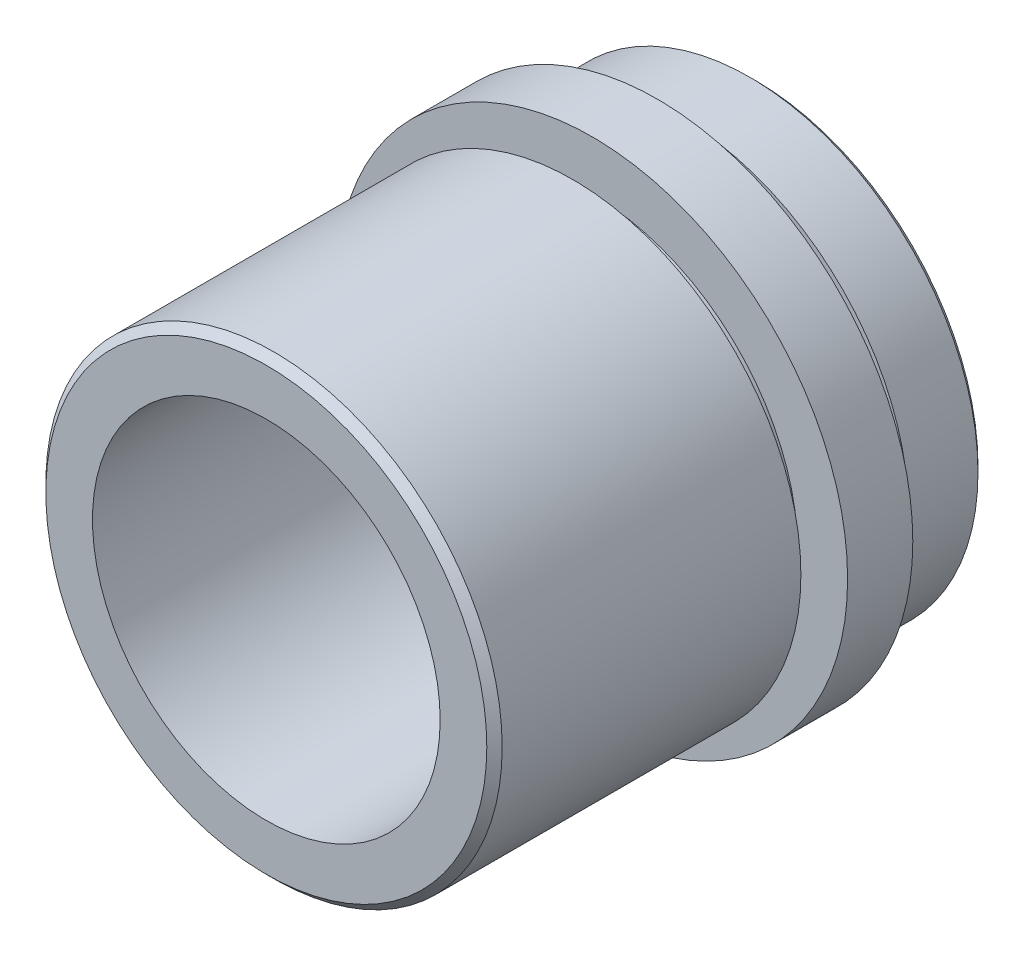
ISO-10303-21;
HEADER;
FILE_DESCRIPTION(('STEP AP214'),'2;1');
FILE_NAME('part.step','',(''),(''),'','','');
FILE_SCHEMA(('AUTOMOTIVE_DESIGN { 1 0 10303 214 1 1 1 1 }'));
ENDSEC;
DATA;
#1=APPLICATION_CONTEXT('core data for automotive mechanical design processes');
#2=APPLICATION_PROTOCOL_DEFINITION('international standard','automotive_design',2000,#1);
#3=PRODUCT_CONTEXT('',#1,'mechanical');
#4=PRODUCT('Part','Part','',(#3));
#5=PRODUCT_RELATED_PRODUCT_CATEGORY('part','',(#4));
#6=PRODUCT_DEFINITION_FORMATION('','',#4);
#7=PRODUCT_DEFINITION_CONTEXT('part definition',#1,'design');
#8=PRODUCT_DEFINITION('design','',#6,#7);
#9=PRODUCT_DEFINITION_SHAPE('','',#8);
#10=(LENGTH_UNIT() NAMED_UNIT(*) SI_UNIT(.MILLI.,.METRE.));
#11=(NAMED_UNIT(*) PLANE_ANGLE_UNIT() SI_UNIT($,.RADIAN.));
#12=(NAMED_UNIT(*) SI_UNIT($,.STERADIAN.) SOLID_ANGLE_UNIT());
#13=UNCERTAINTY_MEASURE_WITH_UNIT(LENGTH_MEASURE(1.E-05),#10,'distance_accuracy_value','');
#14=(GEOMETRIC_REPRESENTATION_CONTEXT(3) GLOBAL_UNCERTAINTY_ASSIGNED_CONTEXT((#13)) GLOBAL_UNIT_ASSIGNED_CONTEXT((#10,
#11,#12)) REPRESENTATION_CONTEXT('',''));
#15=CARTESIAN_POINT('',(0.,0.,0.));
#16=DIRECTION('',(0.,0.,1.));
#17=DIRECTION('',(1.,0.,0.));
#18=AXIS2_PLACEMENT_3D('',#15,#16,#17);
#19=CARTESIAN_POINT('',(0.,0.,0.));
#20=DIRECTION('',(0.,0.,0.999999999999985));
#21=DIRECTION('',(0.999999999999998,0.,0.));
#22=AXIS2_PLACEMENT_3D('',#19,#20,#21);
#23=CYLINDRICAL_SURFACE('',#22,21.);
#24=CARTESIAN_POINT('',(7.21644966006352E-13,0.,0.5));
#25=DIRECTION('',(0.,0.,0.999999999999985));
#26=DIRECTION('',(0.999999999999998,0.,0.));
#27=AXIS2_PLACEMENT_3D('',#24,#25,#26);
#28=CIRCLE('',#27,21.);
#29=CARTESIAN_POINT('',(21.,0.,0.5));
#30=VERTEX_POINT('',#29);
#31=EDGE_CURVE('E73',#30,#30,#28,.T.);
#32=CARTESIAN_POINT('',(0.,0.,6.89999999999999));
#33=DIRECTION('',(0.,0.,0.999999999999985));
#34=DIRECTION('',(0.999999999999998,0.,0.));
#35=AXIS2_PLACEMENT_3D('',#32,#33,#34);
#36=CIRCLE('',#35,21.);
#37=CARTESIAN_POINT('',(21.,0.,6.89999999999999));
#38=VERTEX_POINT('',#37);
#39=EDGE_CURVE('E82',#38,#38,#36,.T.);
#40=CARTESIAN_POINT('',(21.,0.,0.5));
#41=CARTESIAN_POINT('',(21.,0.,0.566666666666667));
#42=CARTESIAN_POINT('',(21.,0.,0.633333333333334));
#43=CARTESIAN_POINT('',(21.,0.,0.766666666666667));
#44=CARTESIAN_POINT('',(21.,0.,0.833333333333333));
#45=CARTESIAN_POINT('',(21.,0.,0.966666666666666));
#46=CARTESIAN_POINT('',(21.,0.,1.03333333333333));
#47=CARTESIAN_POINT('',(21.,0.,1.16666666666667));
#48=CARTESIAN_POINT('',(21.,0.,1.23333333333333));
#49=CARTESIAN_POINT('',(21.,0.,1.36666666666667));
#50=CARTESIAN_POINT('',(21.,0.,1.43333333333333));
#51=CARTESIAN_POINT('',(21.,0.,1.56666666666667));
#52=CARTESIAN_POINT('',(21.,0.,1.63333333333333));
#53=CARTESIAN_POINT('',(21.,0.,1.76666666666666));
#54=CARTESIAN_POINT('',(21.,0.,1.83333333333333));
#55=CARTESIAN_POINT('',(21.,0.,1.96666666666666));
#56=CARTESIAN_POINT('',(21.,0.,2.03333333333333));
#57=CARTESIAN_POINT('',(21.,0.,2.16666666666666));
#58=CARTESIAN_POINT('',(21.,0.,2.23333333333333));
#59=CARTESIAN_POINT('',(21.,0.,2.36666666666666));
#60=CARTESIAN_POINT('',(21.,0.,2.43333333333333));
#61=CARTESIAN_POINT('',(21.,0.,2.56666666666666));
#62=CARTESIAN_POINT('',(21.,0.,2.63333333333333));
#63=CARTESIAN_POINT('',(21.,0.,2.76666666666666));
#64=CARTESIAN_POINT('',(21.,0.,2.83333333333333));
#65=CARTESIAN_POINT('',(21.,0.,2.96666666666666));
#66=CARTESIAN_POINT('',(21.,0.,3.03333333333333));
#67=CARTESIAN_POINT('',(21.,0.,3.16666666666666));
#68=CARTESIAN_POINT('',(21.,0.,3.23333333333333));
#69=CARTESIAN_POINT('',(21.,0.,3.36666666666666));
#70=CARTESIAN_POINT('',(21.,0.,3.43333333333333));
#71=CARTESIAN_POINT('',(21.,0.,3.56666666666666));
#72=CARTESIAN_POINT('',(21.,0.,3.63333333333333));
#73=CARTESIAN_POINT('',(21.,0.,3.76666666666666));
#74=CARTESIAN_POINT('',(21.,0.,3.83333333333333));
#75=CARTESIAN_POINT('',(21.,0.,3.96666666666666));
#76=CARTESIAN_POINT('',(21.,0.,4.03333333333333));
#77=CARTESIAN_POINT('',(21.,0.,4.16666666666666));
#78=CARTESIAN_POINT('',(21.,0.,4.23333333333333));
#79=CARTESIAN_POINT('',(21.,0.,4.36666666666666));
#80=CARTESIAN_POINT('',(21.,0.,4.43333333333333));
#81=CARTESIAN_POINT('',(21.,0.,4.56666666666666));
#82=CARTESIAN_POINT('',(21.,0.,4.63333333333333));
#83=CARTESIAN_POINT('',(21.,0.,4.76666666666666));
#84=CARTESIAN_POINT('',(21.,0.,4.83333333333333));
#85=CARTESIAN_POINT('',(21.,0.,4.96666666666666));
#86=CARTESIAN_POINT('',(21.,0.,5.03333333333333));
#87=CARTESIAN_POINT('',(21.,0.,5.16666666666666));
#88=CARTESIAN_POINT('',(21.,0.,5.23333333333333));
#89=CARTESIAN_POINT('',(21.,0.,5.36666666666666));
#90=CARTESIAN_POINT('',(21.,0.,5.43333333333333));
#91=CARTESIAN_POINT('',(21.,0.,5.56666666666666));
#92=CARTESIAN_POINT('',(21.,0.,5.63333333333332));
#93=CARTESIAN_POINT('',(21.,0.,5.76666666666666));
#94=CARTESIAN_POINT('',(21.,0.,5.83333333333333));
#95=CARTESIAN_POINT('',(21.,0.,5.96666666666666));
#96=CARTESIAN_POINT('',(21.,0.,6.03333333333332));
#97=CARTESIAN_POINT('',(21.,0.,6.16666666666666));
#98=CARTESIAN_POINT('',(21.,0.,6.23333333333332));
#99=CARTESIAN_POINT('',(21.,0.,6.36666666666666));
#100=CARTESIAN_POINT('',(21.,0.,6.43333333333332));
#101=CARTESIAN_POINT('',(21.,0.,6.56666666666666));
#102=CARTESIAN_POINT('',(21.,0.,6.63333333333332));
#103=CARTESIAN_POINT('',(21.,0.,6.76666666666666));
#104=CARTESIAN_POINT('',(21.,0.,6.83333333333332));
#105=CARTESIAN_POINT('',(21.,0.,6.89999999999999));
#106=B_SPLINE_CURVE_WITH_KNOTS('',3,(#40,#41,#42,#43,#44,#45,#46,#47,#48,#49,#50,#51,#52,#53,
#54,#55,#56,#57,#58,#59,#60,#61,#62,#63,#64,#65,#66,#67,#68,#69,#70,#71,#72,#73,#74,#75,#76,#77,
#78,#79,#80,#81,#82,#83,#84,#85,#86,#87,#88,#89,#90,#91,#92,#93,#94,#95,#96,#97,#98,#99,#100,
#101,#102,#103,#104,#105),.UNSPECIFIED.,.F.,.F.,(4,2,2,2,2,2,2,2,2,2,2,2,2,2,2,2,2,2,2,2,2,2,2,
2,2,2,2,2,2,2,2,2,4),(0.,0.2,0.399999999999999,0.599999999999999,0.799999999999998,
0.999999999999998,1.2,1.4,1.6,1.8,2.,2.2,2.4,2.6,2.79999999999999,2.99999999999999,
3.19999999999999,3.39999999999999,3.59999999999999,3.79999999999999,3.99999999999999,
4.19999999999999,4.39999999999999,4.59999999999999,4.79999999999999,4.99999999999999,
5.19999999999999,5.39999999999999,5.59999999999999,5.79999999999999,5.99999999999999,
6.19999999999999,6.39999999999999),.UNSPECIFIED.);
#107=EDGE_CURVE('BSEAM32',#30,#38,#106,.T.);
#108=ORIENTED_EDGE('',*,*,#31,.T.);
#109=ORIENTED_EDGE('',*,*,#39,.F.);
#110=ORIENTED_EDGE('',*,*,#107,.T.);
#111=ORIENTED_EDGE('',*,*,#107,.F.);
#112=EDGE_LOOP('',(#108,#110,#109,#111));
#113=FACE_BOUND('',#112,.T.);
#114=ADVANCED_FACE('F32',(#113),#23,.T.);
#115=CARTESIAN_POINT('',(0.,21.,0.));
#116=DIRECTION('',(0.,0.,0.999999999999985));
#117=DIRECTION('',(0.999999999999998,0.,0.));
#118=AXIS2_PLACEMENT_3D('',#115,#116,#117);
#119=PLANE('',#118);
#120=CARTESIAN_POINT('',(0.,0.,0.));
#121=DIRECTION('',(0.,0.,0.999999999999985));
#122=DIRECTION('',(0.999999999999998,0.,0.));
#123=AXIS2_PLACEMENT_3D('',#120,#121,#122);
#124=CIRCLE('',#123,17.);
#125=CARTESIAN_POINT('',(17.,0.,0.));
#126=VERTEX_POINT('',#125);
#127=EDGE_CURVE('E67',#126,#126,#124,.T.);
#128=ORIENTED_EDGE('',*,*,#127,.T.);
#129=EDGE_LOOP('',(#128));
#130=FACE_BOUND('',#129,.T.);
#131=CARTESIAN_POINT('',(0.,0.,0.));
#132=DIRECTION('',(0.,0.,0.999999999999985));
#133=DIRECTION('',(0.999999999999998,0.,0.));
#134=AXIS2_PLACEMENT_3D('',#131,#132,#133);
#135=CIRCLE('',#134,20.5);
#136=CARTESIAN_POINT('',(20.5000000000007,0.,0.));
#137=VERTEX_POINT('',#136);
#138=EDGE_CURVE('E70',#137,#137,#135,.T.);
#139=ORIENTED_EDGE('',*,*,#138,.F.);
#140=EDGE_LOOP('',(#139));
#141=FACE_BOUND('',#140,.T.);
#142=ADVANCED_FACE('F90',(#130,#141),#119,.F.);
#143=CARTESIAN_POINT('',(4.44089209850063E-13,-1.11022302462516E-13,45.));
#144=DIRECTION('',(0.,0.,-0.999999999999985));
#145=DIRECTION('',(-0.999999999999998,0.,0.));
#146=AXIS2_PLACEMENT_3D('',#143,#144,#145);
#147=PLANE('',#146);
#148=CARTESIAN_POINT('',(4.44089209850063E-13,-1.11022302462516E-13,45.));
#149=DIRECTION('',(0.,0.,0.999999999999985));
#150=DIRECTION('',(0.999999999999998,0.,0.));
#151=AXIS2_PLACEMENT_3D('',#148,#149,#150);
#152=CIRCLE('',#151,20.2928932188134);
#153=CARTESIAN_POINT('',(20.2928932188138,-1.02010447547401E-13,45.));
#154=VERTEX_POINT('',#153);
#155=EDGE_CURVE('E47',#154,#154,#152,.T.);
#156=ORIENTED_EDGE('',*,*,#155,.T.);
#157=EDGE_LOOP('',(#156));
#158=FACE_BOUND('',#157,.T.);
#159=CARTESIAN_POINT('',(4.44089209850063E-13,-1.11022302462516E-13,45.));
#160=DIRECTION('',(0.,0.,0.999999999999985));
#161=DIRECTION('',(0.999999999999998,0.,0.));
#162=AXIS2_PLACEMENT_3D('',#159,#160,#161);
#163=CIRCLE('',#162,16.);
#164=CARTESIAN_POINT('',(16.,0.,45.));
#165=VERTEX_POINT('',#164);
#166=EDGE_CURVE('E61',#165,#165,#163,.T.);
#167=ORIENTED_EDGE('',*,*,#166,.F.);
#168=EDGE_LOOP('',(#167));
#169=FACE_BOUND('',#168,.T.);
#170=ADVANCED_FACE('F96',(#158,#169),#147,.F.);
#171=CARTESIAN_POINT('',(3.88578058618805E-13,23.4999999999989,8.99999999999994));
#172=DIRECTION('',(0.,0.,0.999999999999985));
#173=DIRECTION('',(0.999999999999998,0.,0.));
#174=AXIS2_PLACEMENT_3D('',#171,#172,#173);
#175=PLANE('',#174);
#176=CARTESIAN_POINT('',(7.49400541621981E-13,-1.11022302462516E-13,8.99999999999998));
#177=DIRECTION('',(0.,0.,0.999999999999985));
#178=DIRECTION('',(0.999999999999998,0.,0.));
#179=AXIS2_PLACEMENT_3D('',#176,#177,#178);
#180=CIRCLE('',#179,23.5);
#181=CARTESIAN_POINT('',(23.5000000000007,-1.00586206031039E-13,8.99999999999998));
#182=VERTEX_POINT('',#181);
#183=EDGE_CURVE('E39',#182,#182,#180,.T.);
#184=ORIENTED_EDGE('',*,*,#183,.F.);
#185=EDGE_LOOP('',(#184));
#186=FACE_BOUND('',#185,.T.);
#187=CARTESIAN_POINT('',(7.49400541621981E-13,-1.11022302462516E-13,8.99999999999998));
#188=DIRECTION('',(0.,0.,0.999999999999985));
#189=DIRECTION('',(0.999999999999998,0.,0.));
#190=AXIS2_PLACEMENT_3D('',#187,#188,#189);
#191=CIRCLE('',#190,18.9);
#192=CARTESIAN_POINT('',(18.9,0.,8.99999999999998));
#193=VERTEX_POINT('',#192);
#194=EDGE_CURVE('E76',#193,#193,#191,.T.);
#195=ORIENTED_EDGE('',*,*,#194,.T.);
#196=EDGE_LOOP('',(#195));
#197=FACE_BOUND('',#196,.T.);
#198=ADVANCED_FACE('F117',(#186,#197),#175,.F.);
#199=CARTESIAN_POINT('',(0.,0.,15.));
#200=DIRECTION('',(0.,0.,0.999999999999985));
#201=DIRECTION('',(0.999999999999998,0.,0.));
#202=AXIS2_PLACEMENT_3D('',#199,#200,#201);
#203=CYLINDRICAL_SURFACE('',#202,21.);
#204=CARTESIAN_POINT('',(4.44089209850063E-13,-1.11022302462516E-13,44.2928932188134));
#205=DIRECTION('',(0.,0.,0.999999999999985));
#206=DIRECTION('',(0.999999999999998,0.,0.));
#207=AXIS2_PLACEMENT_3D('',#204,#205,#206);
#208=CIRCLE('',#207,21.);
#209=CARTESIAN_POINT('',(21.,0.,44.2928932188134));
#210=VERTEX_POINT('',#209);
#211=EDGE_CURVE('E43',#210,#210,#208,.T.);
#212=CARTESIAN_POINT('',(7.7715611723761E-13,0.,16.8));
#213=DIRECTION('',(0.,0.,0.999999999999985));
#214=DIRECTION('',(0.999999999999998,0.,0.));
#215=AXIS2_PLACEMENT_3D('',#212,#213,#214);
#216=CIRCLE('',#215,21.);
#217=CARTESIAN_POINT('',(21.,0.,16.8));
#218=VERTEX_POINT('',#217);
#219=EDGE_CURVE('E52',#218,#218,#216,.T.);
#220=CARTESIAN_POINT('',(21.,0.,44.2928932188134));
#221=CARTESIAN_POINT('',(21.,0.,44.0065089144508));
#222=CARTESIAN_POINT('',(21.,0.,43.7201246100882));
#223=CARTESIAN_POINT('',(21.,0.,43.1473560013629));
#224=CARTESIAN_POINT('',(21.,0.,42.8609716970002));
#225=CARTESIAN_POINT('',(21.,0.,42.288203088275));
#226=CARTESIAN_POINT('',(21.,0.,42.0018187839123));
#227=CARTESIAN_POINT('',(21.,0.,41.429050175187));
#228=CARTESIAN_POINT('',(21.,0.,41.1426658708244));
#229=CARTESIAN_POINT('',(21.,0.,40.5698972620991));
#230=CARTESIAN_POINT('',(21.,0.,40.2835129577365));
#231=CARTESIAN_POINT('',(21.,0.,39.7107443490112));
#232=CARTESIAN_POINT('',(21.,0.,39.4243600446486));
#233=CARTESIAN_POINT('',(21.,0.,38.8515914359233));
#234=CARTESIAN_POINT('',(21.,0.,38.5652071315606));
#235=CARTESIAN_POINT('',(21.,0.,37.9924385228354));
#236=CARTESIAN_POINT('',(21.,0.,37.7060542184727));
#237=CARTESIAN_POINT('',(21.,0.,37.1332856097474));
#238=CARTESIAN_POINT('',(21.,0.,36.8469013053848));
#239=CARTESIAN_POINT('',(21.,0.,36.2741326966595));
#240=CARTESIAN_POINT('',(21.,0.,35.9877483922969));
#241=CARTESIAN_POINT('',(21.,0.,35.4149797835716));
#242=CARTESIAN_POINT('',(21.,0.,35.128595479209));
#243=CARTESIAN_POINT('',(21.,0.,34.5558268704837));
#244=CARTESIAN_POINT('',(21.,0.,34.269442566121));
#245=CARTESIAN_POINT('',(21.,0.,33.6966739573958));
#246=CARTESIAN_POINT('',(21.,0.,33.4102896530331));
#247=CARTESIAN_POINT('',(21.,0.,32.8375210443078));
#248=CARTESIAN_POINT('',(21.,0.,32.5511367399452));
#249=CARTESIAN_POINT('',(21.,0.,31.9783681312199));
#250=CARTESIAN_POINT('',(21.,0.,31.6919838268573));
#251=CARTESIAN_POINT('',(21.,0.,31.119215218132));
#252=CARTESIAN_POINT('',(21.,0.,30.8328309137694));
#253=CARTESIAN_POINT('',(21.,0.,30.2600623050441));
#254=CARTESIAN_POINT('',(21.,0.,29.9736780006814));
#255=CARTESIAN_POINT('',(21.,0.,29.4009093919562));
#256=CARTESIAN_POINT('',(21.,0.,29.1145250875935));
#257=CARTESIAN_POINT('',(21.,0.,28.5417564788682));
#258=CARTESIAN_POINT('',(21.,0.,28.2553721745056));
#259=CARTESIAN_POINT('',(21.,0.,27.6826035657803));
#260=CARTESIAN_POINT('',(21.,0.,27.3962192614177));
#261=CARTESIAN_POINT('',(21.,0.,26.8234506526924));
#262=CARTESIAN_POINT('',(21.,0.,26.5370663483298));
#263=CARTESIAN_POINT('',(21.,0.,25.9642977396045));
#264=CARTESIAN_POINT('',(21.,0.,25.6779134352418));
#265=CARTESIAN_POINT('',(21.,0.,25.1051448265166));
#266=CARTESIAN_POINT('',(21.,0.,24.8187605221539));
#267=CARTESIAN_POINT('',(21.,0.,24.2459919134286));
#268=CARTESIAN_POINT('',(21.,0.,23.959607609066));
#269=CARTESIAN_POINT('',(21.,0.,23.3868390003407));
#270=CARTESIAN_POINT('',(21.,0.,23.1004546959781));
#271=CARTESIAN_POINT('',(21.,0.,22.5276860872528));
#272=CARTESIAN_POINT('',(21.,0.,22.2413017828902));
#273=CARTESIAN_POINT('',(21.,0.,21.6685331741649));
#274=CARTESIAN_POINT('',(21.,0.,21.3821488698022));
#275=CARTESIAN_POINT('',(21.,0.,20.809380261077));
#276=CARTESIAN_POINT('',(21.,0.,20.5229959567143));
#277=CARTESIAN_POINT('',(21.,0.,19.950227347989));
#278=CARTESIAN_POINT('',(21.,0.,19.6638430436264));
#279=CARTESIAN_POINT('',(21.,0.,19.0910744349011));
#280=CARTESIAN_POINT('',(21.,0.,18.8046901305385));
#281=CARTESIAN_POINT('',(21.,0.,18.2319215218132));
#282=CARTESIAN_POINT('',(21.,0.,17.9455372174506));
#283=CARTESIAN_POINT('',(21.,0.,17.3727686087253));
#284=CARTESIAN_POINT('',(21.,0.,17.0863843043626));
#285=CARTESIAN_POINT('',(21.,0.,16.8));
#286=B_SPLINE_CURVE_WITH_KNOTS('',3,(#220,#221,#222,#223,#224,#225,#226,#227,#228,#229,#230,
#231,#232,#233,#234,#235,#236,#237,#238,#239,#240,#241,#242,#243,#244,#245,#246,#247,#248,#249,
#250,#251,#252,#253,#254,#255,#256,#257,#258,#259,#260,#261,#262,#263,#264,#265,#266,#267,#268,
#269,#270,#271,#272,#273,#274,#275,#276,#277,#278,#279,#280,#281,#282,#283,#284,#285),
.UNSPECIFIED.,.F.,.F.,(4,2,2,2,2,2,2,2,2,2,2,2,2,2,2,2,2,2,2,2,2,2,2,2,2,2,2,2,2,2,2,2,4),(0.,
0.85915291308792,1.71830582617584,2.57745873926376,3.43661165235168,4.29576456543961,
5.15491747852752,6.01407039161544,6.87322330470336,7.73237621779128,8.5915291308792,
9.45068204396712,10.309834957055,11.168987870143,12.0281407832309,12.8872936963188,
13.7464466094067,14.6055995224946,15.4647524355826,16.3239053486705,17.1830582617584,
18.0422111748463,18.9013640879342,19.7605170010222,20.6196699141101,21.478822827198,
22.3379757402859,23.1971286533738,24.0562815664618,24.9154344795497,25.7745873926376,
26.6337403057255,27.4928932188134),.UNSPECIFIED.);
#287=EDGE_CURVE('BSEAM113',#210,#218,#286,.T.);
#288=ORIENTED_EDGE('',*,*,#211,.F.);
#289=ORIENTED_EDGE('',*,*,#219,.T.);
#290=ORIENTED_EDGE('',*,*,#287,.T.);
#291=ORIENTED_EDGE('',*,*,#287,.F.);
#292=EDGE_LOOP('',(#288,#290,#289,#291));
#293=FACE_BOUND('',#292,.T.);
#294=ADVANCED_FACE('F113',(#293),#203,.T.);
#295=CARTESIAN_POINT('',(4.44089209850063E-13,-1.11022302462516E-13,45.));
#296=DIRECTION('',(0.,0.,-0.999999999999985));
#297=DIRECTION('',(-0.999999999999998,0.,0.));
#298=AXIS2_PLACEMENT_3D('',#295,#296,#297);
#299=CONICAL_SURFACE('',#298,20.2928932188134,0.785398163397461);
#300=ORIENTED_EDGE('',*,*,#211,.T.);
#301=EDGE_LOOP('',(#300));
#302=FACE_BOUND('',#301,.T.);
#303=ORIENTED_EDGE('',*,*,#155,.F.);
#304=EDGE_LOOP('',(#303));
#305=FACE_BOUND('',#304,.T.);
#306=ADVANCED_FACE('F109',(#302,#305),#299,.T.);
#307=CARTESIAN_POINT('',(4.44089209850063E-13,20.9999999999999,16.8));
#308=DIRECTION('',(0.,0.,-0.999999999999985));
#309=DIRECTION('',(-0.999999999999998,0.,0.));
#310=AXIS2_PLACEMENT_3D('',#307,#308,#309);
#311=PLANE('',#310);
#312=CARTESIAN_POINT('',(7.7715611723761E-13,0.,16.8));
#313=DIRECTION('',(0.,0.,0.999999999999985));
#314=DIRECTION('',(0.999999999999998,0.,0.));
#315=AXIS2_PLACEMENT_3D('',#312,#313,#314);
#316=CIRCLE('',#315,18.9);
#317=CARTESIAN_POINT('',(18.9,0.,16.8));
#318=VERTEX_POINT('',#317);
#319=EDGE_CURVE('E55',#318,#318,#316,.T.);
#320=ORIENTED_EDGE('',*,*,#319,.T.);
#321=EDGE_LOOP('',(#320));
#322=FACE_BOUND('',#321,.T.);
#323=ORIENTED_EDGE('',*,*,#219,.F.);
#324=EDGE_LOOP('',(#323));
#325=FACE_BOUND('',#324,.T.);
#326=ADVANCED_FACE('F105',(#322,#325),#311,.T.);
#327=CARTESIAN_POINT('',(0.,0.,15.));
#328=DIRECTION('',(0.,0.,0.999999999999985));
#329=DIRECTION('',(0.999999999999998,0.,0.));
#330=AXIS2_PLACEMENT_3D('',#327,#328,#329);
#331=CYLINDRICAL_SURFACE('',#330,18.9);
#332=CARTESIAN_POINT('',(0.,0.,15.));
#333=DIRECTION('',(0.,0.,0.999999999999985));
#334=DIRECTION('',(0.999999999999998,0.,0.));
#335=AXIS2_PLACEMENT_3D('',#332,#333,#334);
#336=CIRCLE('',#335,18.9);
#337=CARTESIAN_POINT('',(18.9,0.,15.));
#338=VERTEX_POINT('',#337);
#339=EDGE_CURVE('E58',#338,#338,#336,.T.);
#340=CARTESIAN_POINT('',(18.9,0.,15.));
#341=CARTESIAN_POINT('',(18.9,0.,15.01875));
#342=CARTESIAN_POINT('',(18.9,0.,15.0375));
#343=CARTESIAN_POINT('',(18.9,0.,15.075));
#344=CARTESIAN_POINT('',(18.9,0.,15.09375));
#345=CARTESIAN_POINT('',(18.9,0.,15.13125));
#346=CARTESIAN_POINT('',(18.9,0.,15.15));
#347=CARTESIAN_POINT('',(18.9,0.,15.1875));
#348=CARTESIAN_POINT('',(18.9,0.,15.20625));
#349=CARTESIAN_POINT('',(18.9,0.,15.24375));
#350=CARTESIAN_POINT('',(18.9,0.,15.2625));
#351=CARTESIAN_POINT('',(18.9,0.,15.3));
#352=CARTESIAN_POINT('',(18.9,0.,15.31875));
#353=CARTESIAN_POINT('',(18.9,0.,15.35625));
#354=CARTESIAN_POINT('',(18.9,0.,15.375));
#355=CARTESIAN_POINT('',(18.9,0.,15.4125));
#356=CARTESIAN_POINT('',(18.9,0.,15.43125));
#357=CARTESIAN_POINT('',(18.9,0.,15.46875));
#358=CARTESIAN_POINT('',(18.9,0.,15.4875));
#359=CARTESIAN_POINT('',(18.9,0.,15.525));
#360=CARTESIAN_POINT('',(18.9,0.,15.54375));
#361=CARTESIAN_POINT('',(18.9,0.,15.58125));
#362=CARTESIAN_POINT('',(18.9,0.,15.6));
#363=CARTESIAN_POINT('',(18.9,0.,15.6375));
#364=CARTESIAN_POINT('',(18.9,0.,15.65625));
#365=CARTESIAN_POINT('',(18.9,0.,15.69375));
#366=CARTESIAN_POINT('',(18.9,0.,15.7125));
#367=CARTESIAN_POINT('',(18.9,0.,15.75));
#368=CARTESIAN_POINT('',(18.9,0.,15.76875));
#369=CARTESIAN_POINT('',(18.9,0.,15.80625));
#370=CARTESIAN_POINT('',(18.9,0.,15.825));
#371=CARTESIAN_POINT('',(18.9,0.,15.8625));
#372=CARTESIAN_POINT('',(18.9,0.,15.88125));
#373=CARTESIAN_POINT('',(18.9,0.,15.91875));
#374=CARTESIAN_POINT('',(18.9,0.,15.9375));
#375=CARTESIAN_POINT('',(18.9,0.,15.975));
#376=CARTESIAN_POINT('',(18.9,0.,15.99375));
#377=CARTESIAN_POINT('',(18.9,0.,16.03125));
#378=CARTESIAN_POINT('',(18.9,0.,16.05));
#379=CARTESIAN_POINT('',(18.9,0.,16.0875));
#380=CARTESIAN_POINT('',(18.9,0.,16.10625));
#381=CARTESIAN_POINT('',(18.9,0.,16.14375));
#382=CARTESIAN_POINT('',(18.9,0.,16.1625));
#383=CARTESIAN_POINT('',(18.9,0.,16.2));
#384=CARTESIAN_POINT('',(18.9,0.,16.21875));
#385=CARTESIAN_POINT('',(18.9,0.,16.25625));
#386=CARTESIAN_POINT('',(18.9,0.,16.275));
#387=CARTESIAN_POINT('',(18.9,0.,16.3125));
#388=CARTESIAN_POINT('',(18.9,0.,16.33125));
#389=CARTESIAN_POINT('',(18.9,0.,16.36875));
#390=CARTESIAN_POINT('',(18.9,0.,16.3875));
#391=CARTESIAN_POINT('',(18.9,0.,16.425));
#392=CARTESIAN_POINT('',(18.9,0.,16.44375));
#393=CARTESIAN_POINT('',(18.9,0.,16.48125));
#394=CARTESIAN_POINT('',(18.9,0.,16.5));
#395=CARTESIAN_POINT('',(18.9,0.,16.5375));
#396=CARTESIAN_POINT('',(18.9,0.,16.55625));
#397=CARTESIAN_POINT('',(18.9,0.,16.59375));
#398=CARTESIAN_POINT('',(18.9,0.,16.6125));
#399=CARTESIAN_POINT('',(18.9,0.,16.65));
#400=CARTESIAN_POINT('',(18.9,0.,16.66875));
#401=CARTESIAN_POINT('',(18.9,0.,16.70625));
#402=CARTESIAN_POINT('',(18.9,0.,16.725));
#403=CARTESIAN_POINT('',(18.9,0.,16.7625));
#404=CARTESIAN_POINT('',(18.9,0.,16.78125));
#405=CARTESIAN_POINT('',(18.9,0.,16.8));
#406=B_SPLINE_CURVE_WITH_KNOTS('',3,(#340,#341,#342,#343,#344,#345,#346,#347,#348,#349,#350,
#351,#352,#353,#354,#355,#356,#357,#358,#359,#360,#361,#362,#363,#364,#365,#366,#367,#368,#369,
#370,#371,#372,#373,#374,#375,#376,#377,#378,#379,#380,#381,#382,#383,#384,#385,#386,#387,#388,
#389,#390,#391,#392,#393,#394,#395,#396,#397,#398,#399,#400,#401,#402,#403,#404,#405),
.UNSPECIFIED.,.F.,.F.,(4,2,2,2,2,2,2,2,2,2,2,2,2,2,2,2,2,2,2,2,2,2,2,2,2,2,2,2,2,2,2,2,4),(0.,
0.0562500000000007,0.112500000000001,0.168750000000001,0.225000000000001,0.28125,
0.337500000000001,0.39375,0.450000000000001,0.50625,0.5625,0.618749999999999,0.674999999999998,
0.731249999999999,0.7875,0.843750000000001,0.899999999999998,0.956249999999999,1.0125,1.06875,
1.125,1.18125,1.2375,1.29375,1.35,1.40625,1.4625,1.51875,1.575,1.63125,1.6875,1.74375,1.8),.UNSPECIFIED.);
#407=EDGE_CURVE('BSEAM101',#338,#318,#406,.T.);
#408=ORIENTED_EDGE('',*,*,#339,.T.);
#409=ORIENTED_EDGE('',*,*,#319,.F.);
#410=ORIENTED_EDGE('',*,*,#407,.T.);
#411=ORIENTED_EDGE('',*,*,#407,.F.);
#412=EDGE_LOOP('',(#408,#410,#409,#411));
#413=FACE_BOUND('',#412,.T.);
#414=ADVANCED_FACE('F101',(#413),#331,.T.);
#415=CARTESIAN_POINT('',(7.49400541621981E-13,-1.11022302462516E-13,8.99999999999998));
#416=DIRECTION('',(0.,0.,0.999999999999985));
#417=DIRECTION('',(0.999999999999998,0.,0.));
#418=AXIS2_PLACEMENT_3D('',#415,#416,#417);
#419=CYLINDRICAL_SURFACE('',#418,23.5);
#420=CARTESIAN_POINT('',(0.,0.,15.));
#421=DIRECTION('',(0.,0.,0.999999999999985));
#422=DIRECTION('',(0.999999999999998,0.,0.));
#423=AXIS2_PLACEMENT_3D('',#420,#421,#422);
#424=CIRCLE('',#423,23.5);
#425=CARTESIAN_POINT('',(23.5000000000007,-1.00586206031039E-13,15.));
#426=VERTEX_POINT('',#425);
#427=EDGE_CURVE('E10',#426,#426,#424,.T.);
#428=CARTESIAN_POINT('',(23.5000000000007,-1.00586206031039E-13,15.));
#429=CARTESIAN_POINT('',(23.5000000000007,-1.00586206031039E-13,14.9375));
#430=CARTESIAN_POINT('',(23.5000000000007,-1.00586206031039E-13,14.875));
#431=CARTESIAN_POINT('',(23.5000000000007,-1.00586206031039E-13,14.75));
#432=CARTESIAN_POINT('',(23.5000000000007,-1.00586206031039E-13,14.6875));
#433=CARTESIAN_POINT('',(23.5000000000007,-1.00586206031039E-13,14.5625));
#434=CARTESIAN_POINT('',(23.5000000000007,-1.00586206031039E-13,14.5));
#435=CARTESIAN_POINT('',(23.5000000000007,-1.00586206031039E-13,14.375));
#436=CARTESIAN_POINT('',(23.5000000000007,-1.00586206031039E-13,14.3125));
#437=CARTESIAN_POINT('',(23.5000000000007,-1.00586206031039E-13,14.1875));
#438=CARTESIAN_POINT('',(23.5000000000007,-1.00586206031039E-13,14.125));
#439=CARTESIAN_POINT('',(23.5000000000007,-1.00586206031039E-13,14.));
#440=CARTESIAN_POINT('',(23.5000000000007,-1.00586206031039E-13,13.9375));
#441=CARTESIAN_POINT('',(23.5000000000007,-1.00586206031039E-13,13.8125));
#442=CARTESIAN_POINT('',(23.5000000000007,-1.00586206031039E-13,13.75));
#443=CARTESIAN_POINT('',(23.5000000000007,-1.00586206031039E-13,13.625));
#444=CARTESIAN_POINT('',(23.5000000000007,-1.00586206031039E-13,13.5625));
#445=CARTESIAN_POINT('',(23.5000000000007,-1.00586206031039E-13,13.4375));
#446=CARTESIAN_POINT('',(23.5000000000007,-1.00586206031039E-13,13.375));
#447=CARTESIAN_POINT('',(23.5000000000007,-1.00586206031039E-13,13.25));
#448=CARTESIAN_POINT('',(23.5000000000007,-1.00586206031039E-13,13.1875));
#449=CARTESIAN_POINT('',(23.5000000000007,-1.00586206031039E-13,13.0625));
#450=CARTESIAN_POINT('',(23.5000000000007,-1.00586206031039E-13,13.));
#451=CARTESIAN_POINT('',(23.5000000000007,-1.00586206031039E-13,12.875));
#452=CARTESIAN_POINT('',(23.5000000000007,-1.00586206031039E-13,12.8125));
#453=CARTESIAN_POINT('',(23.5000000000007,-1.00586206031039E-13,12.6875));
#454=CARTESIAN_POINT('',(23.5000000000007,-1.00586206031039E-13,12.625));
#455=CARTESIAN_POINT('',(23.5000000000007,-1.00586206031039E-13,12.5));
#456=CARTESIAN_POINT('',(23.5000000000007,-1.00586206031039E-13,12.4375));
#457=CARTESIAN_POINT('',(23.5000000000007,-1.00586206031039E-13,12.3125));
#458=CARTESIAN_POINT('',(23.5000000000007,-1.00586206031039E-13,12.25));
#459=CARTESIAN_POINT('',(23.5000000000007,-1.00586206031039E-13,12.125));
#460=CARTESIAN_POINT('',(23.5000000000007,-1.00586206031039E-13,12.0625));
#461=CARTESIAN_POINT('',(23.5000000000007,-1.00586206031039E-13,11.9375));
#462=CARTESIAN_POINT('',(23.5000000000007,-1.00586206031039E-13,11.875));
#463=CARTESIAN_POINT('',(23.5000000000007,-1.00586206031039E-13,11.75));
#464=CARTESIAN_POINT('',(23.5000000000007,-1.00586206031039E-13,11.6875));
#465=CARTESIAN_POINT('',(23.5000000000007,-1.00586206031039E-13,11.5625));
#466=CARTESIAN_POINT('',(23.5000000000007,-1.00586206031039E-13,11.5));
#467=CARTESIAN_POINT('',(23.5000000000007,-1.00586206031039E-13,11.375));
#468=CARTESIAN_POINT('',(23.5000000000007,-1.00586206031039E-13,11.3125));
#469=CARTESIAN_POINT('',(23.5000000000007,-1.00586206031039E-13,11.1875));
#470=CARTESIAN_POINT('',(23.5000000000007,-1.00586206031039E-13,11.125));
#471=CARTESIAN_POINT('',(23.5000000000007,-1.00586206031039E-13,11.));
#472=CARTESIAN_POINT('',(23.5000000000007,-1.00586206031039E-13,10.9375));
#473=CARTESIAN_POINT('',(23.5000000000007,-1.00586206031039E-13,10.8125));
#474=CARTESIAN_POINT('',(23.5000000000007,-1.00586206031039E-13,10.75));
#475=CARTESIAN_POINT('',(23.5000000000007,-1.00586206031039E-13,10.625));
#476=CARTESIAN_POINT('',(23.5000000000007,-1.00586206031039E-13,10.5625));
#477=CARTESIAN_POINT('',(23.5000000000007,-1.00586206031039E-13,10.4375));
#478=CARTESIAN_POINT('',(23.5000000000007,-1.00586206031039E-13,10.375));
#479=CARTESIAN_POINT('',(23.5000000000007,-1.00586206031039E-13,10.25));
#480=CARTESIAN_POINT('',(23.5000000000007,-1.00586206031039E-13,10.1875));
#481=CARTESIAN_POINT('',(23.5000000000007,-1.00586206031039E-13,10.0625));
#482=CARTESIAN_POINT('',(23.5000000000007,-1.00586206031039E-13,9.99999999999998));
#483=CARTESIAN_POINT('',(23.5000000000007,-1.00586206031039E-13,9.87499999999998));
#484=CARTESIAN_POINT('',(23.5000000000007,-1.00586206031039E-13,9.81249999999998));
#485=CARTESIAN_POINT('',(23.5000000000007,-1.00586206031039E-13,9.68749999999998));
#486=CARTESIAN_POINT('',(23.5000000000007,-1.00586206031039E-13,9.62499999999998));
#487=CARTESIAN_POINT('',(23.5000000000007,-1.00586206031039E-13,9.49999999999998));
#488=CARTESIAN_POINT('',(23.5000000000007,-1.00586206031039E-13,9.43749999999998));
#489=CARTESIAN_POINT('',(23.5000000000007,-1.00586206031039E-13,9.31249999999998));
#490=CARTESIAN_POINT('',(23.5000000000007,-1.00586206031039E-13,9.24999999999998));
#491=CARTESIAN_POINT('',(23.5000000000007,-1.00586206031039E-13,9.12499999999998));
#492=CARTESIAN_POINT('',(23.5000000000007,-1.00586206031039E-13,9.06249999999998));
#493=CARTESIAN_POINT('',(23.5000000000007,-1.00586206031039E-13,8.99999999999998));
#494=B_SPLINE_CURVE_WITH_KNOTS('',3,(#428,#429,#430,#431,#432,#433,#434,#435,#436,#437,#438,
#439,#440,#441,#442,#443,#444,#445,#446,#447,#448,#449,#450,#451,#452,#453,#454,#455,#456,#457,
#458,#459,#460,#461,#462,#463,#464,#465,#466,#467,#468,#469,#470,#471,#472,#473,#474,#475,#476,
#477,#478,#479,#480,#481,#482,#483,#484,#485,#486,#487,#488,#489,#490,#491,#492,#493),
.UNSPECIFIED.,.F.,.F.,(4,2,2,2,2,2,2,2,2,2,2,2,2,2,2,2,2,2,2,2,2,2,2,2,2,2,2,2,2,2,2,2,4),(0.,
0.187500000000002,0.375000000000002,0.562500000000002,0.750000000000002,0.937500000000003,1.125,
1.3125,1.5,1.68750000000001,1.87500000000001,2.06250000000001,2.25000000000001,2.43750000000001,
2.62500000000001,2.81250000000001,3.00000000000001,3.18750000000001,3.37500000000001,
3.56250000000001,3.75000000000001,3.93750000000001,4.12500000000001,4.31250000000001,
4.50000000000002,4.68750000000002,4.87500000000002,5.06250000000002,5.25000000000002,
5.43750000000002,5.62500000000002,5.81250000000002,6.00000000000002),.UNSPECIFIED.);
#495=EDGE_CURVE('BSEAM104',#426,#182,#494,.T.);
#496=ORIENTED_EDGE('',*,*,#427,.F.);
#497=ORIENTED_EDGE('',*,*,#183,.T.);
#498=ORIENTED_EDGE('',*,*,#495,.T.);
#499=ORIENTED_EDGE('',*,*,#495,.F.);
#500=EDGE_LOOP('',(#496,#498,#497,#499));
#501=FACE_BOUND('',#500,.T.);
#502=ADVANCED_FACE('F104',(#501),#419,.T.);
#503=CARTESIAN_POINT('',(0.,0.,15.));
#504=DIRECTION('',(0.,0.,-0.999999999999985));
#505=DIRECTION('',(-0.999999999999998,0.,0.));
#506=AXIS2_PLACEMENT_3D('',#503,#504,#505);
#507=PLANE('',#506);
#508=ORIENTED_EDGE('',*,*,#427,.T.);
#509=EDGE_LOOP('',(#508));
#510=FACE_BOUND('',#509,.T.);
#511=ORIENTED_EDGE('',*,*,#339,.F.);
#512=EDGE_LOOP('',(#511));
#513=FACE_BOUND('',#512,.T.);
#514=ADVANCED_FACE('F34',(#510,#513),#507,.F.);
#515=CARTESIAN_POINT('',(0.,0.,0.));
#516=DIRECTION('',(0.,0.,0.999999999999985));
#517=DIRECTION('',(0.999999999999998,0.,0.));
#518=AXIS2_PLACEMENT_3D('',#515,#516,#517);
#519=CYLINDRICAL_SURFACE('',#518,16.);
#520=CARTESIAN_POINT('',(7.21644966006352E-13,0.,1.));
#521=DIRECTION('',(0.,0.,0.999999999999985));
#522=DIRECTION('',(0.999999999999998,0.,0.));
#523=AXIS2_PLACEMENT_3D('',#520,#521,#522);
#524=CIRCLE('',#523,16.);
#525=CARTESIAN_POINT('',(16.,0.,1.));
#526=VERTEX_POINT('',#525);
#527=EDGE_CURVE('E64',#526,#526,#524,.T.);
#528=CARTESIAN_POINT('',(16.,0.,45.));
#529=CARTESIAN_POINT('',(16.,0.,44.5416666666667));
#530=CARTESIAN_POINT('',(16.,0.,44.0833333333333));
#531=CARTESIAN_POINT('',(16.,0.,43.1666666666667));
#532=CARTESIAN_POINT('',(16.,0.,42.7083333333333));
#533=CARTESIAN_POINT('',(16.,0.,41.7916666666667));
#534=CARTESIAN_POINT('',(16.,0.,41.3333333333333));
#535=CARTESIAN_POINT('',(16.,0.,40.4166666666667));
#536=CARTESIAN_POINT('',(16.,0.,39.9583333333333));
#537=CARTESIAN_POINT('',(16.,0.,39.0416666666667));
#538=CARTESIAN_POINT('',(16.,0.,38.5833333333333));
#539=CARTESIAN_POINT('',(16.,0.,37.6666666666667));
#540=CARTESIAN_POINT('',(16.,0.,37.2083333333333));
#541=CARTESIAN_POINT('',(16.,0.,36.2916666666667));
#542=CARTESIAN_POINT('',(16.,0.,35.8333333333333));
#543=CARTESIAN_POINT('',(16.,0.,34.9166666666667));
#544=CARTESIAN_POINT('',(16.,0.,34.4583333333333));
#545=CARTESIAN_POINT('',(16.,0.,33.5416666666667));
#546=CARTESIAN_POINT('',(16.,0.,33.0833333333333));
#547=CARTESIAN_POINT('',(16.,0.,32.1666666666667));
#548=CARTESIAN_POINT('',(16.,0.,31.7083333333333));
#549=CARTESIAN_POINT('',(16.,0.,30.7916666666667));
#550=CARTESIAN_POINT('',(16.,0.,30.3333333333333));
#551=CARTESIAN_POINT('',(16.,0.,29.4166666666667));
#552=CARTESIAN_POINT('',(16.,0.,28.9583333333333));
#553=CARTESIAN_POINT('',(16.,0.,28.0416666666667));
#554=CARTESIAN_POINT('',(16.,0.,27.5833333333333));
#555=CARTESIAN_POINT('',(16.,0.,26.6666666666667));
#556=CARTESIAN_POINT('',(16.,0.,26.2083333333333));
#557=CARTESIAN_POINT('',(16.,0.,25.2916666666667));
#558=CARTESIAN_POINT('',(16.,0.,24.8333333333333));
#559=CARTESIAN_POINT('',(16.,0.,23.9166666666667));
#560=CARTESIAN_POINT('',(16.,0.,23.4583333333333));
#561=CARTESIAN_POINT('',(16.,0.,22.5416666666667));
#562=CARTESIAN_POINT('',(16.,0.,22.0833333333333));
#563=CARTESIAN_POINT('',(16.,0.,21.1666666666667));
#564=CARTESIAN_POINT('',(16.,0.,20.7083333333333));
#565=CARTESIAN_POINT('',(16.,0.,19.7916666666667));
#566=CARTESIAN_POINT('',(16.,0.,19.3333333333333));
#567=CARTESIAN_POINT('',(16.,0.,18.4166666666667));
#568=CARTESIAN_POINT('',(16.,0.,17.9583333333333));
#569=CARTESIAN_POINT('',(16.,0.,17.0416666666667));
#570=CARTESIAN_POINT('',(16.,0.,16.5833333333333));
#571=CARTESIAN_POINT('',(16.,0.,15.6666666666667));
#572=CARTESIAN_POINT('',(16.,0.,15.2083333333333));
#573=CARTESIAN_POINT('',(16.,0.,14.2916666666667));
#574=CARTESIAN_POINT('',(16.,0.,13.8333333333333));
#575=CARTESIAN_POINT('',(16.,0.,12.9166666666667));
#576=CARTESIAN_POINT('',(16.,0.,12.4583333333333));
#577=CARTESIAN_POINT('',(16.,0.,11.5416666666667));
#578=CARTESIAN_POINT('',(16.,0.,11.0833333333333));
#579=CARTESIAN_POINT('',(16.,0.,10.1666666666667));
#580=CARTESIAN_POINT('',(16.,0.,9.70833333333333));
#581=CARTESIAN_POINT('',(16.,0.,8.79166666666666));
#582=CARTESIAN_POINT('',(16.,0.,8.33333333333333));
#583=CARTESIAN_POINT('',(16.,0.,7.41666666666667));
#584=CARTESIAN_POINT('',(16.,0.,6.95833333333333));
#585=CARTESIAN_POINT('',(16.,0.,6.04166666666666));
#586=CARTESIAN_POINT('',(16.,0.,5.58333333333333));
#587=CARTESIAN_POINT('',(16.,0.,4.66666666666667));
#588=CARTESIAN_POINT('',(16.,0.,4.20833333333333));
#589=CARTESIAN_POINT('',(16.,0.,3.29166666666667));
#590=CARTESIAN_POINT('',(16.,0.,2.83333333333333));
#591=CARTESIAN_POINT('',(16.,0.,1.91666666666667));
#592=CARTESIAN_POINT('',(16.,0.,1.45833333333333));
#593=CARTESIAN_POINT('',(16.,0.,1.));
#594=B_SPLINE_CURVE_WITH_KNOTS('',3,(#528,#529,#530,#531,#532,#533,#534,#535,#536,#537,#538,
#539,#540,#541,#542,#543,#544,#545,#546,#547,#548,#549,#550,#551,#552,#553,#554,#555,#556,#557,
#558,#559,#560,#561,#562,#563,#564,#565,#566,#567,#568,#569,#570,#571,#572,#573,#574,#575,#576,
#577,#578,#579,#580,#581,#582,#583,#584,#585,#586,#587,#588,#589,#590,#591,#592,#593),
.UNSPECIFIED.,.F.,.F.,(4,2,2,2,2,2,2,2,2,2,2,2,2,2,2,2,2,2,2,2,2,2,2,2,2,2,2,2,2,2,2,2,4),(0.,
1.375,2.75,4.125,5.5,6.875,8.24999999999999,9.62499999999999,11.,12.375,13.75,15.125,16.5,
17.875,19.25,20.625,22.,23.375,24.75,26.125,27.5,28.875,30.25,31.625,33.,34.375,35.75,37.125,
38.5,39.875,41.25,42.625,44.),.UNSPECIFIED.);
#595=EDGE_CURVE('BSEAM129',#165,#526,#594,.T.);
#596=ORIENTED_EDGE('',*,*,#166,.T.);
#597=ORIENTED_EDGE('',*,*,#527,.F.);
#598=ORIENTED_EDGE('',*,*,#595,.T.);
#599=ORIENTED_EDGE('',*,*,#595,.F.);
#600=EDGE_LOOP('',(#596,#598,#597,#599));
#601=FACE_BOUND('',#600,.T.);
#602=ADVANCED_FACE('F129',(#601),#519,.F.);
#603=CARTESIAN_POINT('',(0.,0.,0.));
#604=DIRECTION('',(0.,0.,-0.999999999999985));
#605=DIRECTION('',(-0.999999999999998,0.,0.));
#606=AXIS2_PLACEMENT_3D('',#603,#604,#605);
#607=CONICAL_SURFACE('',#606,17.,0.785398163397449);
#608=ORIENTED_EDGE('',*,*,#527,.T.);
#609=EDGE_LOOP('',(#608));
#610=FACE_BOUND('',#609,.T.);
#611=ORIENTED_EDGE('',*,*,#127,.F.);
#612=EDGE_LOOP('',(#611));
#613=FACE_BOUND('',#612,.T.);
#614=ADVANCED_FACE('F133',(#610,#613),#607,.F.);
#615=CARTESIAN_POINT('',(7.21644966006352E-13,0.,0.5));
#616=DIRECTION('',(0.,0.,0.999999999999985));
#617=DIRECTION('',(0.999999999999998,0.,0.));
#618=AXIS2_PLACEMENT_3D('',#615,#616,#617);
#619=CONICAL_SURFACE('',#618,21.,0.785398163397449);
#620=CARTESIAN_POINT('',(20.5000000000007,0.,0.));
#621=CARTESIAN_POINT('',(20.505208333334,0.,0.0052083333333342));
#622=CARTESIAN_POINT('',(20.5104166666673,0.,0.0104166666666672));
#623=CARTESIAN_POINT('',(20.520833333334,0.,0.0208333333333333));
#624=CARTESIAN_POINT('',(20.5260416666673,0.,0.0260416666666663));
#625=CARTESIAN_POINT('',(20.536458333334,0.,0.0364583333333331));
#626=CARTESIAN_POINT('',(20.5416666666673,0.,0.0416666666666668));
#627=CARTESIAN_POINT('',(20.552083333334,0.,0.0520833333333337));
#628=CARTESIAN_POINT('',(20.5572916666673,0.,0.0572916666666669));
#629=CARTESIAN_POINT('',(20.567708333334,0.,0.0677083333333332));
#630=CARTESIAN_POINT('',(20.5729166666673,0.,0.0729166666666663));
#631=CARTESIAN_POINT('',(20.583333333334,0.,0.0833333333333332));
#632=CARTESIAN_POINT('',(20.5885416666673,0.,0.088541666666667));
#633=CARTESIAN_POINT('',(20.598958333334,0.,0.0989583333333336));
#634=CARTESIAN_POINT('',(20.6041666666673,0.,0.104166666666666));
#635=CARTESIAN_POINT('',(20.614583333334,0.,0.114583333333333));
#636=CARTESIAN_POINT('',(20.6197916666673,0.,0.119791666666667));
#637=CARTESIAN_POINT('',(20.630208333334,0.,0.130208333333334));
#638=CARTESIAN_POINT('',(20.6354166666673,0.,0.135416666666667));
#639=CARTESIAN_POINT('',(20.645833333334,0.,0.145833333333333));
#640=CARTESIAN_POINT('',(20.6510416666673,0.,0.151041666666667));
#641=CARTESIAN_POINT('',(20.661458333334,0.,0.161458333333334));
#642=CARTESIAN_POINT('',(20.6666666666673,0.,0.166666666666667));
#643=CARTESIAN_POINT('',(20.677083333334,0.,0.177083333333333));
#644=CARTESIAN_POINT('',(20.6822916666673,0.,0.182291666666666));
#645=CARTESIAN_POINT('',(20.692708333334,0.,0.192708333333333));
#646=CARTESIAN_POINT('',(20.6979166666673,0.,0.197916666666667));
#647=CARTESIAN_POINT('',(20.708333333334,0.,0.208333333333334));
#648=CARTESIAN_POINT('',(20.7135416666673,0.,0.213541666666667));
#649=CARTESIAN_POINT('',(20.723958333334,0.,0.223958333333333));
#650=CARTESIAN_POINT('',(20.7291666666673,0.,0.229166666666667));
#651=CARTESIAN_POINT('',(20.739583333334,0.,0.239583333333334));
#652=CARTESIAN_POINT('',(20.7447916666673,0.,0.244791666666667));
#653=CARTESIAN_POINT('',(20.755208333334,0.,0.255208333333333));
#654=CARTESIAN_POINT('',(20.7604166666673,0.,0.260416666666667));
#655=CARTESIAN_POINT('',(20.770833333334,0.,0.270833333333334));
#656=CARTESIAN_POINT('',(20.7760416666673,0.,0.276041666666667));
#657=CARTESIAN_POINT('',(20.786458333334,0.,0.286458333333333));
#658=CARTESIAN_POINT('',(20.7916666666673,0.,0.291666666666667));
#659=CARTESIAN_POINT('',(20.802083333334,0.,0.302083333333333));
#660=CARTESIAN_POINT('',(20.8072916666673,0.,0.307291666666667));
#661=CARTESIAN_POINT('',(20.817708333334,0.,0.317708333333334));
#662=CARTESIAN_POINT('',(20.8229166666673,0.,0.322916666666667));
#663=CARTESIAN_POINT('',(20.833333333334,0.,0.333333333333333));
#664=CARTESIAN_POINT('',(20.8385416666673,0.,0.338541666666667));
#665=CARTESIAN_POINT('',(20.848958333334,0.,0.348958333333334));
#666=CARTESIAN_POINT('',(20.8541666666673,0.,0.354166666666667));
#667=CARTESIAN_POINT('',(20.864583333334,0.,0.364583333333333));
#668=CARTESIAN_POINT('',(20.8697916666673,0.,0.369791666666667));
#669=CARTESIAN_POINT('',(20.880208333334,0.,0.380208333333334));
#670=CARTESIAN_POINT('',(20.8854166666673,0.,0.385416666666667));
#671=CARTESIAN_POINT('',(20.895833333334,0.,0.395833333333334));
#672=CARTESIAN_POINT('',(20.9010416666673,0.,0.401041666666667));
#673=CARTESIAN_POINT('',(20.911458333334,0.,0.411458333333334));
#674=CARTESIAN_POINT('',(20.9166666666673,0.,0.416666666666667));
#675=CARTESIAN_POINT('',(20.927083333334,0.,0.427083333333334));
#676=CARTESIAN_POINT('',(20.9322916666673,0.,0.432291666666667));
#677=CARTESIAN_POINT('',(20.942708333334,0.,0.442708333333334));
#678=CARTESIAN_POINT('',(20.9479166666673,0.,0.447916666666667));
#679=CARTESIAN_POINT('',(20.958333333334,0.,0.458333333333334));
#680=CARTESIAN_POINT('',(20.9635416666673,0.,0.463541666666667));
#681=CARTESIAN_POINT('',(20.973958333334,0.,0.473958333333333));
#682=CARTESIAN_POINT('',(20.9791666666673,0.,0.479166666666667));
#683=CARTESIAN_POINT('',(20.989583333334,0.,0.489583333333334));
#684=CARTESIAN_POINT('',(20.9947916666673,0.,0.494791666666668));
#685=CARTESIAN_POINT('',(21.0000000000007,0.,0.500000000000001));
#686=B_SPLINE_CURVE_WITH_KNOTS('',3,(#620,#621,#622,#623,#624,#625,#626,#627,#628,#629,#630,
#631,#632,#633,#634,#635,#636,#637,#638,#639,#640,#641,#642,#643,#644,#645,#646,#647,#648,#649,
#650,#651,#652,#653,#654,#655,#656,#657,#658,#659,#660,#661,#662,#663,#664,#665,#666,#667,#668,
#669,#670,#671,#672,#673,#674,#675,#676,#677,#678,#679,#680,#681,#682,#683,#684,#685),
.UNSPECIFIED.,.F.,.F.,(4,2,2,2,2,2,2,2,2,2,2,2,2,2,2,2,2,2,2,2,2,2,2,2,2,2,2,2,2,2,2,2,4),(0.,
0.0220970869120784,0.0441941738241593,0.0662912607362376,0.0883883476483185,0.110485434560399,
0.132582521472478,0.154679608384559,0.176776695296637,0.198873782208718,0.220970869120796,
0.243067956032877,0.265165042944958,0.287262129857036,0.309359216769117,0.331456303681196,
0.353553390593277,0.375650477505355,0.397747564417436,0.419844651329517,0.441941738241595,
0.464038825153676,0.486135912065754,0.508232998977835,0.530330085889913,0.552427172801994,
0.574524259714075,0.596621346626154,0.618718433538235,0.640815520450313,0.662912607362394,
0.685009694274472,0.707106781186553),.UNSPECIFIED.);
#687=EDGE_CURVE('BSEAM145',#137,#30,#686,.T.);
#688=ORIENTED_EDGE('',*,*,#138,.T.);
#689=ORIENTED_EDGE('',*,*,#31,.F.);
#690=ORIENTED_EDGE('',*,*,#687,.T.);
#691=ORIENTED_EDGE('',*,*,#687,.F.);
#692=EDGE_LOOP('',(#688,#690,#689,#691));
#693=FACE_BOUND('',#692,.T.);
#694=ADVANCED_FACE('F145',(#693),#619,.T.);
#695=CARTESIAN_POINT('',(0.,0.,0.));
#696=DIRECTION('',(0.,0.,0.999999999999985));
#697=DIRECTION('',(0.999999999999998,0.,0.));
#698=AXIS2_PLACEMENT_3D('',#695,#696,#697);
#699=CYLINDRICAL_SURFACE('',#698,18.9);
#700=CARTESIAN_POINT('',(0.,0.,6.89999999999999));
#701=DIRECTION('',(0.,0.,0.999999999999985));
#702=DIRECTION('',(0.999999999999998,0.,0.));
#703=AXIS2_PLACEMENT_3D('',#700,#701,#702);
#704=CIRCLE('',#703,18.9);
#705=CARTESIAN_POINT('',(18.9,0.,6.89999999999999));
#706=VERTEX_POINT('',#705);
#707=EDGE_CURVE('E79',#706,#706,#704,.T.);
#708=CARTESIAN_POINT('',(18.9,0.,6.89999999999999));
#709=CARTESIAN_POINT('',(18.9,0.,6.92187499999999));
#710=CARTESIAN_POINT('',(18.9,0.,6.94374999999999));
#711=CARTESIAN_POINT('',(18.9,0.,6.98749999999999));
#712=CARTESIAN_POINT('',(18.9,0.,7.00937499999999));
#713=CARTESIAN_POINT('',(18.9,0.,7.05312499999999));
#714=CARTESIAN_POINT('',(18.9,0.,7.07499999999999));
#715=CARTESIAN_POINT('',(18.9,0.,7.11874999999999));
#716=CARTESIAN_POINT('',(18.9,0.,7.14062499999999));
#717=CARTESIAN_POINT('',(18.9,0.,7.18437499999999));
#718=CARTESIAN_POINT('',(18.9,0.,7.20624999999999));
#719=CARTESIAN_POINT('',(18.9,0.,7.24999999999999));
#720=CARTESIAN_POINT('',(18.9,0.,7.27187499999999));
#721=CARTESIAN_POINT('',(18.9,0.,7.31562499999999));
#722=CARTESIAN_POINT('',(18.9,0.,7.33749999999999));
#723=CARTESIAN_POINT('',(18.9,0.,7.38124999999999));
#724=CARTESIAN_POINT('',(18.9,0.,7.40312499999999));
#725=CARTESIAN_POINT('',(18.9,0.,7.44687499999999));
#726=CARTESIAN_POINT('',(18.9,0.,7.46874999999999));
#727=CARTESIAN_POINT('',(18.9,0.,7.51249999999999));
#728=CARTESIAN_POINT('',(18.9,0.,7.53437499999999));
#729=CARTESIAN_POINT('',(18.9,0.,7.57812499999999));
#730=CARTESIAN_POINT('',(18.9,0.,7.59999999999999));
#731=CARTESIAN_POINT('',(18.9,0.,7.64374999999999));
#732=CARTESIAN_POINT('',(18.9,0.,7.66562499999999));
#733=CARTESIAN_POINT('',(18.9,0.,7.70937499999999));
#734=CARTESIAN_POINT('',(18.9,0.,7.73124999999999));
#735=CARTESIAN_POINT('',(18.9,0.,7.77499999999999));
#736=CARTESIAN_POINT('',(18.9,0.,7.79687499999998));
#737=CARTESIAN_POINT('',(18.9,0.,7.84062499999999));
#738=CARTESIAN_POINT('',(18.9,0.,7.86249999999998));
#739=CARTESIAN_POINT('',(18.9,0.,7.90624999999998));
#740=CARTESIAN_POINT('',(18.9,0.,7.92812499999998));
#741=CARTESIAN_POINT('',(18.9,0.,7.97187499999998));
#742=CARTESIAN_POINT('',(18.9,0.,7.99374999999999));
#743=CARTESIAN_POINT('',(18.9,0.,8.03749999999998));
#744=CARTESIAN_POINT('',(18.9,0.,8.05937499999999));
#745=CARTESIAN_POINT('',(18.9,0.,8.10312499999998));
#746=CARTESIAN_POINT('',(18.9,0.,8.12499999999998));
#747=CARTESIAN_POINT('',(18.9,0.,8.16874999999998));
#748=CARTESIAN_POINT('',(18.9,0.,8.19062499999998));
#749=CARTESIAN_POINT('',(18.9,0.,8.23437499999998));
#750=CARTESIAN_POINT('',(18.9,0.,8.25624999999998));
#751=CARTESIAN_POINT('',(18.9,0.,8.29999999999998));
#752=CARTESIAN_POINT('',(18.9,0.,8.32187499999998));
#753=CARTESIAN_POINT('',(18.9,0.,8.36562499999998));
#754=CARTESIAN_POINT('',(18.9,0.,8.38749999999998));
#755=CARTESIAN_POINT('',(18.9,0.,8.43124999999998));
#756=CARTESIAN_POINT('',(18.9,0.,8.45312499999998));
#757=CARTESIAN_POINT('',(18.9,0.,8.49687499999998));
#758=CARTESIAN_POINT('',(18.9,0.,8.51874999999998));
#759=CARTESIAN_POINT('',(18.9,0.,8.56249999999998));
#760=CARTESIAN_POINT('',(18.9,0.,8.58437499999998));
#761=CARTESIAN_POINT('',(18.9,0.,8.62812499999998));
#762=CARTESIAN_POINT('',(18.9,0.,8.64999999999998));
#763=CARTESIAN_POINT('',(18.9,0.,8.69374999999998));
#764=CARTESIAN_POINT('',(18.9,0.,8.71562499999998));
#765=CARTESIAN_POINT('',(18.9,0.,8.75937499999998));
#766=CARTESIAN_POINT('',(18.9,0.,8.78124999999998));
#767=CARTESIAN_POINT('',(18.9,0.,8.82499999999998));
#768=CARTESIAN_POINT('',(18.9,0.,8.84687499999998));
#769=CARTESIAN_POINT('',(18.9,0.,8.89062499999998));
#770=CARTESIAN_POINT('',(18.9,0.,8.91249999999998));
#771=CARTESIAN_POINT('',(18.9,0.,8.95624999999998));
#772=CARTESIAN_POINT('',(18.9,0.,8.97812499999998));
#773=CARTESIAN_POINT('',(18.9,0.,8.99999999999998));
#774=B_SPLINE_CURVE_WITH_KNOTS('',3,(#708,#709,#710,#711,#712,#713,#714,#715,#716,#717,#718,
#719,#720,#721,#722,#723,#724,#725,#726,#727,#728,#729,#730,#731,#732,#733,#734,#735,#736,#737,
#738,#739,#740,#741,#742,#743,#744,#745,#746,#747,#748,#749,#750,#751,#752,#753,#754,#755,#756,
#757,#758,#759,#760,#761,#762,#763,#764,#765,#766,#767,#768,#769,#770,#771,#772,#773),
.UNSPECIFIED.,.F.,.F.,(4,2,2,2,2,2,2,2,2,2,2,2,2,2,2,2,2,2,2,2,2,2,2,2,2,2,2,2,2,2,2,2,4),(0.,
0.0656249999999997,0.131249999999999,0.196874999999998,0.262499999999998,0.328124999999999,
0.393749999999998,0.459374999999998,0.524999999999998,0.590624999999997,0.656249999999996,
0.721874999999996,0.787499999999997,0.853124999999996,0.918749999999996,0.984374999999994,1.05,
1.115625,1.18124999999999,1.24687499999999,1.31249999999999,1.37812499999999,1.44374999999999,
1.50937499999999,1.57499999999999,1.64062499999999,1.70624999999999,1.77187499999999,
1.83749999999999,1.90312499999999,1.96874999999999,2.03437499999999,2.09999999999999),.UNSPECIFIED.);
#775=EDGE_CURVE('BSEAM152',#706,#193,#774,.T.);
#776=ORIENTED_EDGE('',*,*,#707,.T.);
#777=ORIENTED_EDGE('',*,*,#194,.F.);
#778=ORIENTED_EDGE('',*,*,#775,.T.);
#779=ORIENTED_EDGE('',*,*,#775,.F.);
#780=EDGE_LOOP('',(#776,#778,#777,#779));
#781=FACE_BOUND('',#780,.T.);
#782=ADVANCED_FACE('F152',(#781),#699,.T.);
#783=CARTESIAN_POINT('',(4.16333634234434E-13,18.8999999999994,6.89999999999989));
#784=DIRECTION('',(0.,0.,0.999999999999985));
#785=DIRECTION('',(0.999999999999998,0.,0.));
#786=AXIS2_PLACEMENT_3D('',#783,#784,#785);
#787=PLANE('',#786);
#788=ORIENTED_EDGE('',*,*,#39,.T.);
#789=EDGE_LOOP('',(#788));
#790=FACE_BOUND('',#789,.T.);
#791=ORIENTED_EDGE('',*,*,#707,.F.);
#792=EDGE_LOOP('',(#791));
#793=FACE_BOUND('',#792,.T.);
#794=ADVANCED_FACE('F86',(#790,#793),#787,.T.);
#795=CLOSED_SHELL('',(#114,#142,#170,#198,#294,#306,#326,#414,#502,#514,#602,#614,#694,#782,#794));
#796=MANIFOLD_SOLID_BREP('B2',#795);
#797=ADVANCED_BREP_SHAPE_REPRESENTATION('',(#18,#796),#14);
#798=SHAPE_DEFINITION_REPRESENTATION(#9,#797);
ENDSEC;
END-ISO-10303-21;
